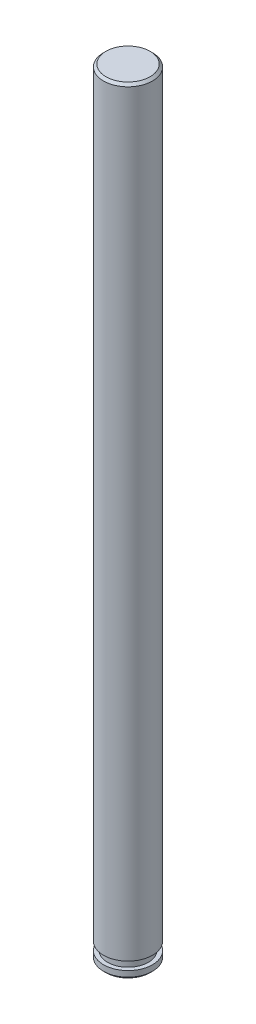
ISO-10303-21;
HEADER;
FILE_DESCRIPTION(('STEP AP214'),'2;1');
FILE_NAME('part.step','',(''),(''),'','','');
FILE_SCHEMA(('AUTOMOTIVE_DESIGN { 1 0 10303 214 1 1 1 1 }'));
ENDSEC;
DATA;
#1=APPLICATION_CONTEXT('core data for automotive mechanical design processes');
#2=APPLICATION_PROTOCOL_DEFINITION('international standard','automotive_design',2000,#1);
#3=PRODUCT_CONTEXT('',#1,'mechanical');
#4=PRODUCT('Part','Part','',(#3));
#5=PRODUCT_RELATED_PRODUCT_CATEGORY('part','',(#4));
#6=PRODUCT_DEFINITION_FORMATION('','',#4);
#7=PRODUCT_DEFINITION_CONTEXT('part definition',#1,'design');
#8=PRODUCT_DEFINITION('design','',#6,#7);
#9=PRODUCT_DEFINITION_SHAPE('','',#8);
#10=(LENGTH_UNIT() NAMED_UNIT(*) SI_UNIT(.MILLI.,.METRE.));
#11=(NAMED_UNIT(*) PLANE_ANGLE_UNIT() SI_UNIT($,.RADIAN.));
#12=(NAMED_UNIT(*) SI_UNIT($,.STERADIAN.) SOLID_ANGLE_UNIT());
#13=UNCERTAINTY_MEASURE_WITH_UNIT(LENGTH_MEASURE(1.E-05),#10,'distance_accuracy_value','');
#14=(GEOMETRIC_REPRESENTATION_CONTEXT(3) GLOBAL_UNCERTAINTY_ASSIGNED_CONTEXT((#13)) GLOBAL_UNIT_ASSIGNED_CONTEXT((#10,
#11,#12)) REPRESENTATION_CONTEXT('',''));
#15=CARTESIAN_POINT('',(0.,0.,0.));
#16=DIRECTION('',(0.,0.,1.));
#17=DIRECTION('',(1.,0.,0.));
#18=AXIS2_PLACEMENT_3D('',#15,#16,#17);
#19=CARTESIAN_POINT('',(0.,47.5,0.));
#20=DIRECTION('',(0.,-1.,0.));
#21=DIRECTION('',(0.,0.,-1.));
#22=AXIS2_PLACEMENT_3D('',#19,#20,#21);
#23=CYLINDRICAL_SURFACE('',#22,1.5);
#24=CARTESIAN_POINT('',(0.,0.500000000000003,0.));
#25=DIRECTION('',(0.,-1.,0.));
#26=DIRECTION('',(1.,0.,0.));
#27=AXIS2_PLACEMENT_3D('',#24,#25,#26);
#28=CIRCLE('',#27,1.5);
#29=CARTESIAN_POINT('',(1.5,0.500000000000002,0.));
#30=VERTEX_POINT('',#29);
#31=EDGE_CURVE('E54',#30,#30,#28,.T.);
#32=ORIENTED_EDGE('',*,*,#31,.T.);
#33=EDGE_LOOP('',(#32));
#34=FACE_BOUND('',#33,.T.);
#35=CARTESIAN_POINT('',(0.,0.150000000000011,0.));
#36=DIRECTION('',(0.,1.,0.));
#37=DIRECTION('',(0.,0.,1.));
#38=AXIS2_PLACEMENT_3D('',#35,#36,#37);
#39=CIRCLE('',#38,1.5);
#40=CARTESIAN_POINT('',(0.,0.150000000000011,1.5));
#41=VERTEX_POINT('',#40);
#42=EDGE_CURVE('E45',#41,#41,#39,.T.);
#43=ORIENTED_EDGE('',*,*,#42,.T.);
#44=EDGE_LOOP('',(#43));
#45=FACE_BOUND('',#44,.T.);
#46=ADVANCED_FACE('F34',(#34,#45),#23,.T.);
#47=CARTESIAN_POINT('',(0.,0.,0.));
#48=DIRECTION('',(0.,1.,0.));
#49=DIRECTION('',(0.,0.,1.));
#50=AXIS2_PLACEMENT_3D('',#47,#48,#49);
#51=PLANE('',#50);
#52=CARTESIAN_POINT('',(0.,0.,0.));
#53=DIRECTION('',(0.,1.,0.));
#54=DIRECTION('',(0.,0.,1.));
#55=AXIS2_PLACEMENT_3D('',#52,#53,#54);
#56=CIRCLE('',#55,1.34999999999998);
#57=CARTESIAN_POINT('',(0.,0.,1.34999999999998));
#58=VERTEX_POINT('',#57);
#59=EDGE_CURVE('E10',#58,#58,#56,.F.);
#60=ORIENTED_EDGE('',*,*,#59,.T.);
#61=EDGE_LOOP('',(#60));
#62=FACE_BOUND('',#61,.T.);
#63=ADVANCED_FACE('F87',(#62),#51,.F.);
#64=CARTESIAN_POINT('',(0.,0.150000000000011,0.));
#65=DIRECTION('',(0.,1.,0.));
#66=DIRECTION('',(0.,0.,1.));
#67=AXIS2_PLACEMENT_3D('',#64,#65,#66);
#68=CONICAL_SURFACE('',#67,1.5,0.785398163397467);
#69=ORIENTED_EDGE('',*,*,#59,.F.);
#70=EDGE_LOOP('',(#69));
#71=FACE_BOUND('',#70,.T.);
#72=ORIENTED_EDGE('',*,*,#42,.F.);
#73=EDGE_LOOP('',(#72));
#74=FACE_BOUND('',#73,.T.);
#75=ADVANCED_FACE('F36',(#71,#74),#68,.T.);
#76=CARTESIAN_POINT('',(0.,0.500000000000003,0.));
#77=DIRECTION('',(0.,-1.,0.));
#78=DIRECTION('',(1.,0.,0.));
#79=AXIS2_PLACEMENT_3D('',#76,#77,#78);
#80=PLANE('',#79);
#81=ORIENTED_EDGE('',*,*,#31,.F.);
#82=EDGE_LOOP('',(#81));
#83=FACE_BOUND('',#82,.T.);
#84=CARTESIAN_POINT('',(0.,0.500000000000003,0.));
#85=DIRECTION('',(0.,-1.,0.));
#86=DIRECTION('',(1.,0.,0.));
#87=AXIS2_PLACEMENT_3D('',#84,#85,#86);
#88=CIRCLE('',#87,1.25);
#89=CARTESIAN_POINT('',(1.25,0.500000000000002,0.));
#90=VERTEX_POINT('',#89);
#91=EDGE_CURVE('E58',#90,#90,#88,.T.);
#92=ORIENTED_EDGE('',*,*,#91,.T.);
#93=EDGE_LOOP('',(#92));
#94=FACE_BOUND('',#93,.T.);
#95=ADVANCED_FACE('F67',(#83,#94),#80,.F.);
#96=CARTESIAN_POINT('',(0.,1.,0.));
#97=DIRECTION('',(0.,-1.,0.));
#98=DIRECTION('',(1.,0.,0.));
#99=AXIS2_PLACEMENT_3D('',#96,#97,#98);
#100=PLANE('',#99);
#101=CARTESIAN_POINT('',(0.,1.,0.));
#102=DIRECTION('',(0.,-1.,0.));
#103=DIRECTION('',(1.,0.,0.));
#104=AXIS2_PLACEMENT_3D('',#101,#102,#103);
#105=CIRCLE('',#104,1.5);
#106=CARTESIAN_POINT('',(1.5,1.,0.));
#107=VERTEX_POINT('',#106);
#108=EDGE_CURVE('E55',#107,#107,#105,.T.);
#109=ORIENTED_EDGE('',*,*,#108,.T.);
#110=EDGE_LOOP('',(#109));
#111=FACE_BOUND('',#110,.T.);
#112=CARTESIAN_POINT('',(0.,1.,0.));
#113=DIRECTION('',(0.,-1.,0.));
#114=DIRECTION('',(1.,0.,0.));
#115=AXIS2_PLACEMENT_3D('',#112,#113,#114);
#116=CIRCLE('',#115,1.25);
#117=CARTESIAN_POINT('',(1.25,1.,0.));
#118=VERTEX_POINT('',#117);
#119=EDGE_CURVE('E61',#118,#118,#116,.T.);
#120=ORIENTED_EDGE('',*,*,#119,.F.);
#121=EDGE_LOOP('',(#120));
#122=FACE_BOUND('',#121,.T.);
#123=ADVANCED_FACE('F73',(#111,#122),#100,.T.);
#124=CARTESIAN_POINT('',(0.,0.500000000000003,0.));
#125=DIRECTION('',(0.,1.,0.));
#126=DIRECTION('',(0.,0.,1.));
#127=AXIS2_PLACEMENT_3D('',#124,#125,#126);
#128=CYLINDRICAL_SURFACE('',#127,1.25);
#129=ORIENTED_EDGE('',*,*,#91,.F.);
#130=EDGE_LOOP('',(#129));
#131=FACE_BOUND('',#130,.T.);
#132=ORIENTED_EDGE('',*,*,#119,.T.);
#133=EDGE_LOOP('',(#132));
#134=FACE_BOUND('',#133,.T.);
#135=ADVANCED_FACE('F69',(#131,#134),#128,.T.);
#136=CARTESIAN_POINT('',(0.,47.5,0.));
#137=DIRECTION('',(0.,1.,0.));
#138=DIRECTION('',(0.,0.,1.));
#139=AXIS2_PLACEMENT_3D('',#136,#137,#138);
#140=PLANE('',#139);
#141=CARTESIAN_POINT('',(0.,47.5,0.));
#142=DIRECTION('',(0.,1.,0.));
#143=DIRECTION('',(0.,0.,1.));
#144=AXIS2_PLACEMENT_3D('',#141,#142,#143);
#145=CIRCLE('',#144,1.35);
#146=CARTESIAN_POINT('',(0.,47.5,1.35));
#147=VERTEX_POINT('',#146);
#148=EDGE_CURVE('E49',#147,#147,#145,.T.);
#149=ORIENTED_EDGE('',*,*,#148,.T.);
#150=EDGE_LOOP('',(#149));
#151=FACE_BOUND('',#150,.T.);
#152=ADVANCED_FACE('F72',(#151),#140,.T.);
#153=CARTESIAN_POINT('',(0.,47.5,0.));
#154=DIRECTION('',(0.,-1.,0.));
#155=DIRECTION('',(0.,0.,-1.));
#156=AXIS2_PLACEMENT_3D('',#153,#154,#155);
#157=CONICAL_SURFACE('',#156,1.35,0.785398163397468);
#158=CARTESIAN_POINT('',(0.,47.35,0.));
#159=DIRECTION('',(0.,1.,0.));
#160=DIRECTION('',(0.,0.,1.));
#161=AXIS2_PLACEMENT_3D('',#158,#159,#160);
#162=CIRCLE('',#161,1.5);
#163=CARTESIAN_POINT('',(0.,47.35,1.5));
#164=VERTEX_POINT('',#163);
#165=EDGE_CURVE('E41',#164,#164,#162,.F.);
#166=ORIENTED_EDGE('',*,*,#165,.F.);
#167=EDGE_LOOP('',(#166));
#168=FACE_BOUND('',#167,.T.);
#169=ORIENTED_EDGE('',*,*,#148,.F.);
#170=EDGE_LOOP('',(#169));
#171=FACE_BOUND('',#170,.T.);
#172=ADVANCED_FACE('F97',(#168,#171),#157,.T.);
#173=ORIENTED_EDGE('',*,*,#165,.T.);
#174=EDGE_LOOP('',(#173));
#175=FACE_BOUND('',#174,.T.);
#176=ORIENTED_EDGE('',*,*,#108,.F.);
#177=EDGE_LOOP('',(#176));
#178=FACE_BOUND('',#177,.T.);
#179=ADVANCED_FACE('F90',(#175,#178),#23,.T.);
#180=CLOSED_SHELL('',(#46,#63,#75,#95,#123,#135,#152,#172,#179));
#181=MANIFOLD_SOLID_BREP('B2',#180);
#182=ADVANCED_BREP_SHAPE_REPRESENTATION('',(#18,#181),#14);
#183=SHAPE_DEFINITION_REPRESENTATION(#9,#182);
ENDSEC;
END-ISO-10303-21;
